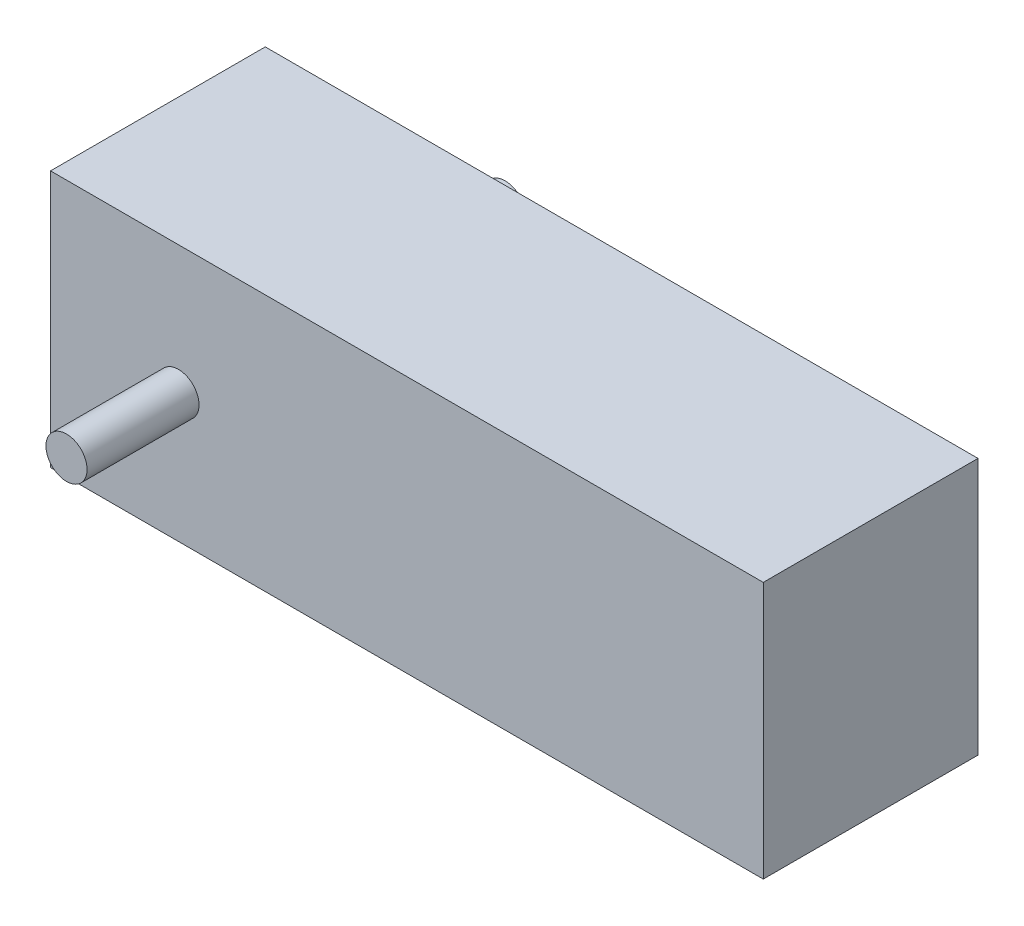
ISO-10303-21;
HEADER;
FILE_DESCRIPTION(('STEP AP214'),'2;1');
FILE_NAME('part.step','',(''),(''),'','','');
FILE_SCHEMA(('AUTOMOTIVE_DESIGN { 1 0 10303 214 1 1 1 1 }'));
ENDSEC;
DATA;
#1=APPLICATION_CONTEXT('core data for automotive mechanical design processes');
#2=APPLICATION_PROTOCOL_DEFINITION('international standard','automotive_design',2000,#1);
#3=PRODUCT_CONTEXT('',#1,'mechanical');
#4=PRODUCT('Part','Part','',(#3));
#5=PRODUCT_RELATED_PRODUCT_CATEGORY('part','',(#4));
#6=PRODUCT_DEFINITION_FORMATION('','',#4);
#7=PRODUCT_DEFINITION_CONTEXT('part definition',#1,'design');
#8=PRODUCT_DEFINITION('design','',#6,#7);
#9=PRODUCT_DEFINITION_SHAPE('','',#8);
#10=(LENGTH_UNIT() NAMED_UNIT(*) SI_UNIT(.MILLI.,.METRE.));
#11=(NAMED_UNIT(*) PLANE_ANGLE_UNIT() SI_UNIT($,.RADIAN.));
#12=(NAMED_UNIT(*) SI_UNIT($,.STERADIAN.) SOLID_ANGLE_UNIT());
#13=UNCERTAINTY_MEASURE_WITH_UNIT(LENGTH_MEASURE(1.E-05),#10,'distance_accuracy_value','');
#14=(GEOMETRIC_REPRESENTATION_CONTEXT(3) GLOBAL_UNCERTAINTY_ASSIGNED_CONTEXT((#13)) GLOBAL_UNIT_ASSIGNED_CONTEXT((#10,
#11,#12)) REPRESENTATION_CONTEXT('',''));
#15=CARTESIAN_POINT('',(0.,0.,0.));
#16=DIRECTION('',(0.,0.,1.));
#17=DIRECTION('',(1.,0.,0.));
#18=AXIS2_PLACEMENT_3D('',#15,#16,#17);
#19=CARTESIAN_POINT('',(31.2,11.25,18.8));
#20=DIRECTION('',(-1.,0.,0.));
#21=DIRECTION('',(0.,0.,1.));
#22=AXIS2_PLACEMENT_3D('',#19,#20,#21);
#23=PLANE('',#22);
#24=DIRECTION('',(0.,1.,0.));
#25=VECTOR('',#24,1.);
#26=CARTESIAN_POINT('',(31.2,11.25,0.));
#27=LINE('',#26,#25);
#28=CARTESIAN_POINT('',(31.2,-11.25,0.));
#29=VERTEX_POINT('',#28);
#30=CARTESIAN_POINT('',(31.2,11.25,0.));
#31=VERTEX_POINT('',#30);
#32=EDGE_CURVE('E109',#29,#31,#27,.T.);
#33=ORIENTED_EDGE('',*,*,#32,.T.);
#34=DIRECTION('',(0.,0.,-1.));
#35=VECTOR('',#34,1.);
#36=CARTESIAN_POINT('',(31.2,11.25,18.8));
#37=LINE('',#36,#35);
#38=CARTESIAN_POINT('',(31.2,11.25,18.8));
#39=VERTEX_POINT('',#38);
#40=EDGE_CURVE('E51',#39,#31,#37,.T.);
#41=ORIENTED_EDGE('',*,*,#40,.F.);
#42=DIRECTION('',(0.,1.,0.));
#43=VECTOR('',#42,1.);
#44=CARTESIAN_POINT('',(31.2,11.25,18.8));
#45=LINE('',#44,#43);
#46=CARTESIAN_POINT('',(31.2,-11.25,18.8));
#47=VERTEX_POINT('',#46);
#48=EDGE_CURVE('E95',#47,#39,#45,.T.);
#49=ORIENTED_EDGE('',*,*,#48,.F.);
#50=DIRECTION('',(0.,0.,-1.));
#51=VECTOR('',#50,1.);
#52=CARTESIAN_POINT('',(31.2,-11.25,18.8));
#53=LINE('',#52,#51);
#54=EDGE_CURVE('E105',#47,#29,#53,.T.);
#55=ORIENTED_EDGE('',*,*,#54,.T.);
#56=EDGE_LOOP('',(#33,#41,#49,#55));
#57=FACE_BOUND('',#56,.T.);
#58=ADVANCED_FACE('F43',(#57),#23,.F.);
#59=CARTESIAN_POINT('',(-31.2,11.25,18.8));
#60=DIRECTION('',(0.,-1.,0.));
#61=DIRECTION('',(0.,0.,-1.));
#62=AXIS2_PLACEMENT_3D('',#59,#60,#61);
#63=PLANE('',#62);
#64=DIRECTION('',(-1.,0.,0.));
#65=VECTOR('',#64,1.);
#66=CARTESIAN_POINT('',(-31.2,11.25,0.));
#67=LINE('',#66,#65);
#68=CARTESIAN_POINT('',(-31.2,11.25,0.));
#69=VERTEX_POINT('',#68);
#70=EDGE_CURVE('E100',#31,#69,#67,.T.);
#71=ORIENTED_EDGE('',*,*,#70,.T.);
#72=DIRECTION('',(0.,0.,-1.));
#73=VECTOR('',#72,1.);
#74=CARTESIAN_POINT('',(-31.2,11.25,18.8));
#75=LINE('',#74,#73);
#76=CARTESIAN_POINT('',(-31.2,11.25,18.8));
#77=VERTEX_POINT('',#76);
#78=EDGE_CURVE('E98',#77,#69,#75,.T.);
#79=ORIENTED_EDGE('',*,*,#78,.F.);
#80=DIRECTION('',(-1.,0.,0.));
#81=VECTOR('',#80,1.);
#82=CARTESIAN_POINT('',(-31.2,11.25,18.8));
#83=LINE('',#82,#81);
#84=EDGE_CURVE('E90',#39,#77,#83,.T.);
#85=ORIENTED_EDGE('',*,*,#84,.F.);
#86=ORIENTED_EDGE('',*,*,#40,.T.);
#87=EDGE_LOOP('',(#71,#79,#85,#86));
#88=FACE_BOUND('',#87,.T.);
#89=ADVANCED_FACE('F99',(#88),#63,.F.);
#90=CARTESIAN_POINT('',(-31.2,11.25,18.8));
#91=DIRECTION('',(1.,0.,0.));
#92=DIRECTION('',(0.,1.,0.));
#93=AXIS2_PLACEMENT_3D('',#90,#91,#92);
#94=PLANE('',#93);
#95=DIRECTION('',(0.,-1.,0.));
#96=VECTOR('',#95,1.);
#97=CARTESIAN_POINT('',(-31.2,11.25,0.));
#98=LINE('',#97,#96);
#99=CARTESIAN_POINT('',(-31.2,-11.25,0.));
#100=VERTEX_POINT('',#99);
#101=EDGE_CURVE('E76',#69,#100,#98,.T.);
#102=ORIENTED_EDGE('',*,*,#101,.T.);
#103=DIRECTION('',(0.,0.,-1.));
#104=VECTOR('',#103,1.);
#105=CARTESIAN_POINT('',(-31.2,-11.25,18.8));
#106=LINE('',#105,#104);
#107=CARTESIAN_POINT('',(-31.2,-11.25,18.8));
#108=VERTEX_POINT('',#107);
#109=EDGE_CURVE('E101',#108,#100,#106,.T.);
#110=ORIENTED_EDGE('',*,*,#109,.F.);
#111=DIRECTION('',(0.,-1.,0.));
#112=VECTOR('',#111,1.);
#113=CARTESIAN_POINT('',(-31.2,11.25,18.8));
#114=LINE('',#113,#112);
#115=EDGE_CURVE('E93',#77,#108,#114,.T.);
#116=ORIENTED_EDGE('',*,*,#115,.F.);
#117=ORIENTED_EDGE('',*,*,#78,.T.);
#118=EDGE_LOOP('',(#102,#110,#116,#117));
#119=FACE_BOUND('',#118,.T.);
#120=ADVANCED_FACE('F103',(#119),#94,.F.);
#121=CARTESIAN_POINT('',(-31.2,-11.25,18.8));
#122=DIRECTION('',(0.,1.,0.));
#123=DIRECTION('',(0.,0.,1.));
#124=AXIS2_PLACEMENT_3D('',#121,#122,#123);
#125=PLANE('',#124);
#126=DIRECTION('',(1.,0.,0.));
#127=VECTOR('',#126,1.);
#128=CARTESIAN_POINT('',(-31.2,-11.25,0.));
#129=LINE('',#128,#127);
#130=EDGE_CURVE('E82',#100,#29,#129,.T.);
#131=ORIENTED_EDGE('',*,*,#130,.T.);
#132=ORIENTED_EDGE('',*,*,#54,.F.);
#133=DIRECTION('',(1.,0.,0.));
#134=VECTOR('',#133,1.);
#135=CARTESIAN_POINT('',(-31.2,-11.25,18.8));
#136=LINE('',#135,#134);
#137=EDGE_CURVE('E59',#108,#47,#136,.T.);
#138=ORIENTED_EDGE('',*,*,#137,.F.);
#139=ORIENTED_EDGE('',*,*,#109,.T.);
#140=EDGE_LOOP('',(#131,#132,#138,#139));
#141=FACE_BOUND('',#140,.T.);
#142=ADVANCED_FACE('F134',(#141),#125,.F.);
#143=CARTESIAN_POINT('',(0.,0.,18.8));
#144=DIRECTION('',(0.,0.,1.));
#145=DIRECTION('',(1.,0.,0.));
#146=AXIS2_PLACEMENT_3D('',#143,#144,#145);
#147=PLANE('',#146);
#148=CARTESIAN_POINT('',(-20.,0.,18.8));
#149=DIRECTION('',(0.,0.,1.));
#150=DIRECTION('',(1.,0.,0.));
#151=AXIS2_PLACEMENT_3D('',#148,#149,#150);
#152=CIRCLE('',#151,1.8);
#153=CARTESIAN_POINT('',(-18.2,0.,18.8));
#154=VERTEX_POINT('',#153);
#155=EDGE_CURVE('E195',#154,#154,#152,.T.);
#156=ORIENTED_EDGE('',*,*,#155,.F.);
#157=EDGE_LOOP('',(#156));
#158=FACE_BOUND('',#157,.T.);
#159=ORIENTED_EDGE('',*,*,#48,.T.);
#160=ORIENTED_EDGE('',*,*,#84,.T.);
#161=ORIENTED_EDGE('',*,*,#115,.T.);
#162=ORIENTED_EDGE('',*,*,#137,.T.);
#163=EDGE_LOOP('',(#159,#160,#161,#162));
#164=FACE_BOUND('',#163,.T.);
#165=ADVANCED_FACE('F91',(#158,#164),#147,.T.);
#166=CARTESIAN_POINT('',(0.,0.,0.));
#167=DIRECTION('',(0.,0.,1.));
#168=DIRECTION('',(1.,0.,0.));
#169=AXIS2_PLACEMENT_3D('',#166,#167,#168);
#170=PLANE('',#169);
#171=CARTESIAN_POINT('',(-20.,0.,0.));
#172=DIRECTION('',(0.,0.,1.));
#173=DIRECTION('',(1.,0.,0.));
#174=AXIS2_PLACEMENT_3D('',#171,#172,#173);
#175=CIRCLE('',#174,1.8);
#176=CARTESIAN_POINT('',(-18.2,0.,0.));
#177=VERTEX_POINT('',#176);
#178=EDGE_CURVE('E11',#177,#177,#175,.F.);
#179=ORIENTED_EDGE('',*,*,#178,.F.);
#180=EDGE_LOOP('',(#179));
#181=FACE_BOUND('',#180,.T.);
#182=ORIENTED_EDGE('',*,*,#32,.F.);
#183=ORIENTED_EDGE('',*,*,#130,.F.);
#184=ORIENTED_EDGE('',*,*,#101,.F.);
#185=ORIENTED_EDGE('',*,*,#70,.F.);
#186=EDGE_LOOP('',(#182,#183,#184,#185));
#187=FACE_BOUND('',#186,.T.);
#188=ADVANCED_FACE('F120',(#181,#187),#170,.F.);
#189=CARTESIAN_POINT('',(-20.,0.,28.6));
#190=DIRECTION('',(0.,0.,-1.));
#191=DIRECTION('',(-1.,0.,0.));
#192=AXIS2_PLACEMENT_3D('',#189,#190,#191);
#193=CYLINDRICAL_SURFACE('',#192,1.8);
#194=CARTESIAN_POINT('',(-20.,0.,28.6));
#195=DIRECTION('',(0.,0.,1.));
#196=DIRECTION('',(1.,0.,0.));
#197=AXIS2_PLACEMENT_3D('',#194,#195,#196);
#198=CIRCLE('',#197,1.8);
#199=CARTESIAN_POINT('',(-18.2,0.,28.6));
#200=VERTEX_POINT('',#199);
#201=EDGE_CURVE('E112',#200,#200,#198,.T.);
#202=ORIENTED_EDGE('',*,*,#201,.F.);
#203=EDGE_LOOP('',(#202));
#204=FACE_BOUND('',#203,.T.);
#205=ORIENTED_EDGE('',*,*,#155,.T.);
#206=EDGE_LOOP('',(#205));
#207=FACE_BOUND('',#206,.T.);
#208=ADVANCED_FACE('F122',(#204,#207),#193,.T.);
#209=CARTESIAN_POINT('',(-20.,0.,28.6));
#210=DIRECTION('',(0.,0.,1.));
#211=DIRECTION('',(1.,0.,0.));
#212=AXIS2_PLACEMENT_3D('',#209,#210,#211);
#213=PLANE('',#212);
#214=ORIENTED_EDGE('',*,*,#201,.T.);
#215=EDGE_LOOP('',(#214));
#216=FACE_BOUND('',#215,.T.);
#217=ADVANCED_FACE('F130',(#216),#213,.T.);
#218=CARTESIAN_POINT('',(-20.,0.,-9.8));
#219=DIRECTION('',(0.,0.,1.));
#220=DIRECTION('',(1.,0.,0.));
#221=AXIS2_PLACEMENT_3D('',#218,#219,#220);
#222=CYLINDRICAL_SURFACE('',#221,1.8);
#223=CARTESIAN_POINT('',(-20.,0.,-9.8));
#224=DIRECTION('',(0.,0.,-1.));
#225=DIRECTION('',(-1.,0.,0.));
#226=AXIS2_PLACEMENT_3D('',#223,#224,#225);
#227=CIRCLE('',#226,1.8);
#228=CARTESIAN_POINT('',(-21.8,0.,-9.8));
#229=VERTEX_POINT('',#228);
#230=EDGE_CURVE('E194',#229,#229,#227,.T.);
#231=ORIENTED_EDGE('',*,*,#230,.F.);
#232=EDGE_LOOP('',(#231));
#233=FACE_BOUND('',#232,.T.);
#234=ORIENTED_EDGE('',*,*,#178,.T.);
#235=EDGE_LOOP('',(#234));
#236=FACE_BOUND('',#235,.T.);
#237=ADVANCED_FACE('F167',(#233,#236),#222,.T.);
#238=CARTESIAN_POINT('',(-20.,0.,-9.8));
#239=DIRECTION('',(0.,0.,-1.));
#240=DIRECTION('',(-1.,0.,0.));
#241=AXIS2_PLACEMENT_3D('',#238,#239,#240);
#242=PLANE('',#241);
#243=ORIENTED_EDGE('',*,*,#230,.T.);
#244=EDGE_LOOP('',(#243));
#245=FACE_BOUND('',#244,.T.);
#246=ADVANCED_FACE('F179',(#245),#242,.T.);
#247=CLOSED_SHELL('',(#58,#89,#120,#142,#165,#188,#208,#217,#237,#246));
#248=MANIFOLD_SOLID_BREP('B2',#247);
#249=ADVANCED_BREP_SHAPE_REPRESENTATION('',(#18,#248),#14);
#250=SHAPE_DEFINITION_REPRESENTATION(#9,#249);
ENDSEC;
END-ISO-10303-21;
